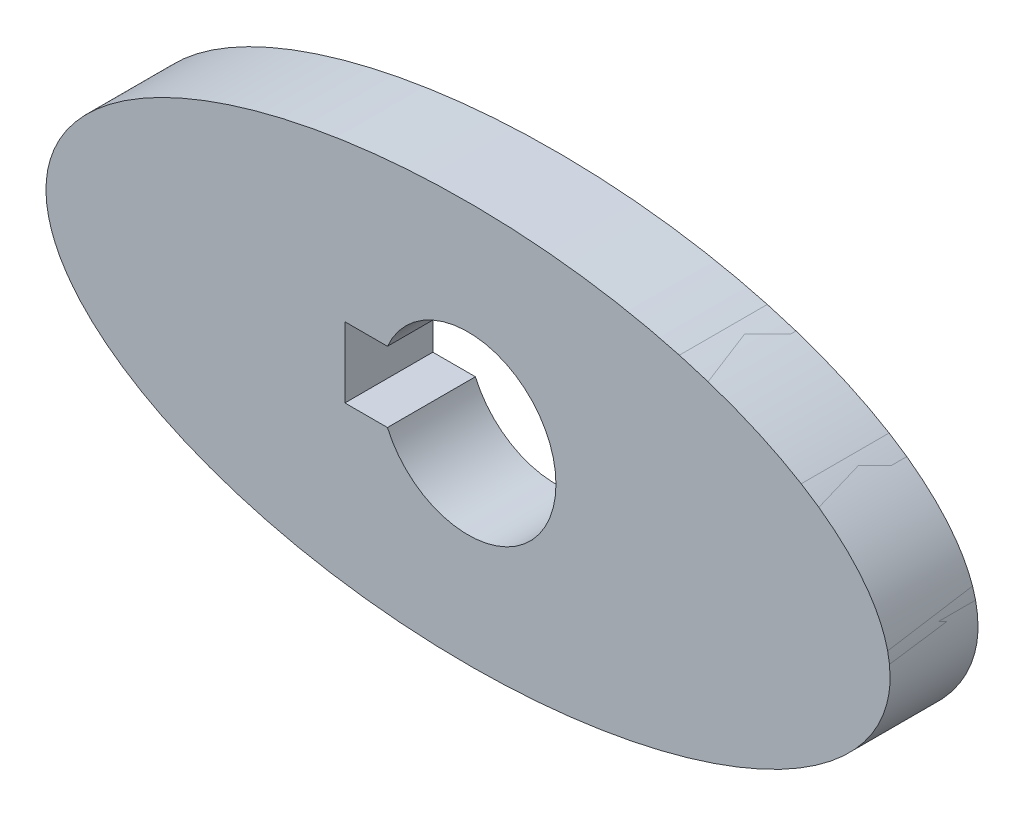
ISO-10303-21;
HEADER;
FILE_DESCRIPTION(('STEP AP214'),'2;1');
FILE_NAME('part.step','',(''),(''),'','','');
FILE_SCHEMA(('AUTOMOTIVE_DESIGN { 1 0 10303 214 1 1 1 1 }'));
ENDSEC;
DATA;
#1=APPLICATION_CONTEXT('core data for automotive mechanical design processes');
#2=APPLICATION_PROTOCOL_DEFINITION('international standard','automotive_design',2000,#1);
#3=PRODUCT_CONTEXT('',#1,'mechanical');
#4=PRODUCT('Part','Part','',(#3));
#5=PRODUCT_RELATED_PRODUCT_CATEGORY('part','',(#4));
#6=PRODUCT_DEFINITION_FORMATION('','',#4);
#7=PRODUCT_DEFINITION_CONTEXT('part definition',#1,'design');
#8=PRODUCT_DEFINITION('design','',#6,#7);
#9=PRODUCT_DEFINITION_SHAPE('','',#8);
#10=(LENGTH_UNIT() NAMED_UNIT(*) SI_UNIT(.MILLI.,.METRE.));
#11=(NAMED_UNIT(*) PLANE_ANGLE_UNIT() SI_UNIT($,.RADIAN.));
#12=(NAMED_UNIT(*) SI_UNIT($,.STERADIAN.) SOLID_ANGLE_UNIT());
#13=UNCERTAINTY_MEASURE_WITH_UNIT(LENGTH_MEASURE(1.E-05),#10,'distance_accuracy_value','');
#14=(GEOMETRIC_REPRESENTATION_CONTEXT(3) GLOBAL_UNCERTAINTY_ASSIGNED_CONTEXT((#13)) GLOBAL_UNIT_ASSIGNED_CONTEXT((#10,
#11,#12)) REPRESENTATION_CONTEXT('',''));
#15=CARTESIAN_POINT('',(0.,0.,0.));
#16=DIRECTION('',(0.,0.,1.));
#17=DIRECTION('',(1.,0.,0.));
#18=AXIS2_PLACEMENT_3D('',#15,#16,#17);
#19=CARTESIAN_POINT('',(0.,0.,5.));
#20=DIRECTION('',(0.,0.,1.));
#21=DIRECTION('',(1.,0.,0.));
#22=AXIS2_PLACEMENT_3D('',#19,#20,#21);
#23=ELLIPSE('',#22,24.,11.3936131898035);
#24=DIRECTION('',(0.,0.,-1.));
#25=VECTOR('',#24,1.);
#26=SURFACE_OF_LINEAR_EXTRUSION('',#23,#25);
#27=CARTESIAN_POINT('',(24.,0.,5.));
#28=VERTEX_POINT('',#27);
#29=EDGE_CURVE('E47',#28,#28,#23,.T.);
#30=ORIENTED_EDGE('',*,*,#29,.T.);
#31=EDGE_LOOP('',(#30));
#32=FACE_BOUND('',#31,.T.);
#33=CARTESIAN_POINT('',(0.,0.,0.));
#34=DIRECTION('',(0.,0.,1.));
#35=DIRECTION('',(1.,0.,0.));
#36=AXIS2_PLACEMENT_3D('',#33,#34,#35);
#37=ELLIPSE('',#36,24.,11.3936131898035);
#38=CARTESIAN_POINT('',(24.,0.,0.));
#39=VERTEX_POINT('',#38);
#40=EDGE_CURVE('E11',#39,#39,#37,.T.);
#41=ORIENTED_EDGE('',*,*,#40,.F.);
#42=EDGE_LOOP('',(#41));
#43=FACE_BOUND('',#42,.T.);
#44=ADVANCED_FACE('F43',(#32,#43),#26,.T.);
#45=OPEN_SHELL('',(#44));
#46=SHELL_BASED_SURFACE_MODEL('B2',(#45));
#47=CARTESIAN_POINT('',(0.,0.,5.));
#48=DIRECTION('',(0.,0.,1.));
#49=DIRECTION('',(1.,0.,0.));
#50=AXIS2_PLACEMENT_3D('',#47,#48,#49);
#51=PLANE('',#50);
#52=CARTESIAN_POINT('',(0.,0.,5.));
#53=DIRECTION('',(0.,0.,1.));
#54=DIRECTION('',(1.,0.,0.));
#55=AXIS2_PLACEMENT_3D('',#52,#53,#54);
#56=ELLIPSE('',#55,24.,11.3936131898035);
#57=CARTESIAN_POINT('',(24.,0.,5.));
#58=VERTEX_POINT('',#57);
#59=EDGE_CURVE('E41',#58,#58,#56,.T.);
#60=ORIENTED_EDGE('',*,*,#59,.T.);
#61=EDGE_LOOP('',(#60));
#62=FACE_BOUND('',#61,.T.);
#63=DIRECTION('',(-1.,0.,0.));
#64=VECTOR('',#63,1.);
#65=CARTESIAN_POINT('',(-7.,2.,5.));
#66=LINE('',#65,#64);
#67=CARTESIAN_POINT('',(-4.58257569495584,2.,5.));
#68=VERTEX_POINT('',#67);
#69=CARTESIAN_POINT('',(-7.,2.,5.));
#70=VERTEX_POINT('',#69);
#71=EDGE_CURVE('E117',#68,#70,#66,.T.);
#72=ORIENTED_EDGE('',*,*,#71,.F.);
#73=CARTESIAN_POINT('',(0.,0.,5.));
#74=DIRECTION('',(0.,0.,1.));
#75=DIRECTION('',(1.,0.,0.));
#76=AXIS2_PLACEMENT_3D('',#73,#74,#75);
#77=CIRCLE('',#76,5.);
#78=CARTESIAN_POINT('',(-4.58257569495584,-2.,5.));
#79=VERTEX_POINT('',#78);
#80=EDGE_CURVE('E109',#79,#68,#77,.T.);
#81=ORIENTED_EDGE('',*,*,#80,.F.);
#82=DIRECTION('',(1.,0.,0.));
#83=VECTOR('',#82,1.);
#84=CARTESIAN_POINT('',(-7.,-2.,5.));
#85=LINE('',#84,#83);
#86=CARTESIAN_POINT('',(-7.,-2.,5.));
#87=VERTEX_POINT('',#86);
#88=EDGE_CURVE('E130',#87,#79,#85,.T.);
#89=ORIENTED_EDGE('',*,*,#88,.F.);
#90=DIRECTION('',(0.,-1.,0.));
#91=VECTOR('',#90,1.);
#92=CARTESIAN_POINT('',(-7.,2.,5.));
#93=LINE('',#92,#91);
#94=EDGE_CURVE('E128',#70,#87,#93,.T.);
#95=ORIENTED_EDGE('',*,*,#94,.F.);
#96=EDGE_LOOP('',(#72,#81,#89,#95));
#97=FACE_BOUND('',#96,.T.);
#98=ADVANCED_FACE('F68',(#62,#97),#51,.T.);
#99=CARTESIAN_POINT('',(0.,0.,0.));
#100=DIRECTION('',(0.,0.,1.));
#101=DIRECTION('',(1.,0.,0.));
#102=AXIS2_PLACEMENT_3D('',#99,#100,#101);
#103=PLANE('',#102);
#104=CARTESIAN_POINT('',(0.,0.,0.));
#105=DIRECTION('',(0.,0.,1.));
#106=DIRECTION('',(1.,0.,0.));
#107=AXIS2_PLACEMENT_3D('',#104,#105,#106);
#108=ELLIPSE('',#107,24.,11.3936131898035);
#109=CARTESIAN_POINT('',(24.,0.,0.));
#110=VERTEX_POINT('',#109);
#111=EDGE_CURVE('E73',#110,#110,#108,.T.);
#112=ORIENTED_EDGE('',*,*,#111,.F.);
#113=EDGE_LOOP('',(#112));
#114=FACE_BOUND('',#113,.T.);
#115=CARTESIAN_POINT('',(0.,0.,0.));
#116=DIRECTION('',(0.,0.,1.));
#117=DIRECTION('',(1.,0.,0.));
#118=AXIS2_PLACEMENT_3D('',#115,#116,#117);
#119=CIRCLE('',#118,5.);
#120=CARTESIAN_POINT('',(-4.58257569495584,-2.,0.));
#121=VERTEX_POINT('',#120);
#122=CARTESIAN_POINT('',(-4.58257569495584,2.,0.));
#123=VERTEX_POINT('',#122);
#124=EDGE_CURVE('E91',#121,#123,#119,.T.);
#125=ORIENTED_EDGE('',*,*,#124,.T.);
#126=DIRECTION('',(-1.,0.,0.));
#127=VECTOR('',#126,1.);
#128=CARTESIAN_POINT('',(-7.,2.,0.));
#129=LINE('',#128,#127);
#130=CARTESIAN_POINT('',(-7.,2.,0.));
#131=VERTEX_POINT('',#130);
#132=EDGE_CURVE('E124',#123,#131,#129,.T.);
#133=ORIENTED_EDGE('',*,*,#132,.T.);
#134=DIRECTION('',(0.,-1.,0.));
#135=VECTOR('',#134,1.);
#136=CARTESIAN_POINT('',(-7.,2.,0.));
#137=LINE('',#136,#135);
#138=CARTESIAN_POINT('',(-7.,-2.,0.));
#139=VERTEX_POINT('',#138);
#140=EDGE_CURVE('E136',#131,#139,#137,.T.);
#141=ORIENTED_EDGE('',*,*,#140,.T.);
#142=DIRECTION('',(1.,0.,0.));
#143=VECTOR('',#142,1.);
#144=CARTESIAN_POINT('',(-7.,-2.,0.));
#145=LINE('',#144,#143);
#146=EDGE_CURVE('E118',#139,#121,#145,.T.);
#147=ORIENTED_EDGE('',*,*,#146,.T.);
#148=EDGE_LOOP('',(#125,#133,#141,#147));
#149=FACE_BOUND('',#148,.T.);
#150=ADVANCED_FACE('F148',(#114,#149),#103,.F.);
#151=DIRECTION('',(0.,0.,-1.));
#152=VECTOR('',#151,1.);
#153=SURFACE_OF_LINEAR_EXTRUSION('',#56,#152);
#154=ORIENTED_EDGE('',*,*,#59,.F.);
#155=EDGE_LOOP('',(#154));
#156=FACE_BOUND('',#155,.T.);
#157=ORIENTED_EDGE('',*,*,#111,.T.);
#158=EDGE_LOOP('',(#157));
#159=FACE_BOUND('',#158,.T.);
#160=ADVANCED_FACE('F70',(#156,#159),#153,.F.);
#161=CARTESIAN_POINT('',(0.,0.,5.));
#162=DIRECTION('',(0.,0.,-1.));
#163=DIRECTION('',(-1.,0.,0.));
#164=AXIS2_PLACEMENT_3D('',#161,#162,#163);
#165=CYLINDRICAL_SURFACE('',#164,5.);
#166=ORIENTED_EDGE('',*,*,#124,.F.);
#167=DIRECTION('',(0.,0.,-1.));
#168=VECTOR('',#167,1.);
#169=CARTESIAN_POINT('',(-4.58257569495584,-2.,5.));
#170=LINE('',#169,#168);
#171=EDGE_CURVE('E113',#79,#121,#170,.T.);
#172=ORIENTED_EDGE('',*,*,#171,.F.);
#173=ORIENTED_EDGE('',*,*,#80,.T.);
#174=DIRECTION('',(0.,0.,-1.));
#175=VECTOR('',#174,1.);
#176=CARTESIAN_POINT('',(-4.58257569495584,2.,5.));
#177=LINE('',#176,#175);
#178=EDGE_CURVE('E112',#68,#123,#177,.T.);
#179=ORIENTED_EDGE('',*,*,#178,.T.);
#180=EDGE_LOOP('',(#166,#172,#173,#179));
#181=FACE_BOUND('',#180,.T.);
#182=ADVANCED_FACE('F111',(#181),#165,.F.);
#183=CARTESIAN_POINT('',(-7.,2.,5.));
#184=DIRECTION('',(0.,-1.,0.));
#185=DIRECTION('',(0.,0.,-1.));
#186=AXIS2_PLACEMENT_3D('',#183,#184,#185);
#187=PLANE('',#186);
#188=ORIENTED_EDGE('',*,*,#132,.F.);
#189=ORIENTED_EDGE('',*,*,#178,.F.);
#190=ORIENTED_EDGE('',*,*,#71,.T.);
#191=DIRECTION('',(0.,0.,-1.));
#192=VECTOR('',#191,1.);
#193=CARTESIAN_POINT('',(-7.,2.,5.));
#194=LINE('',#193,#192);
#195=EDGE_CURVE('E125',#70,#131,#194,.T.);
#196=ORIENTED_EDGE('',*,*,#195,.T.);
#197=EDGE_LOOP('',(#188,#189,#190,#196));
#198=FACE_BOUND('',#197,.T.);
#199=ADVANCED_FACE('F121',(#198),#187,.T.);
#200=CARTESIAN_POINT('',(-7.,2.,5.));
#201=DIRECTION('',(1.,0.,0.));
#202=DIRECTION('',(0.,0.,-1.));
#203=AXIS2_PLACEMENT_3D('',#200,#201,#202);
#204=PLANE('',#203);
#205=ORIENTED_EDGE('',*,*,#140,.F.);
#206=ORIENTED_EDGE('',*,*,#195,.F.);
#207=ORIENTED_EDGE('',*,*,#94,.T.);
#208=DIRECTION('',(0.,0.,-1.));
#209=VECTOR('',#208,1.);
#210=CARTESIAN_POINT('',(-7.,-2.,5.));
#211=LINE('',#210,#209);
#212=EDGE_CURVE('E83',#87,#139,#211,.T.);
#213=ORIENTED_EDGE('',*,*,#212,.T.);
#214=EDGE_LOOP('',(#205,#206,#207,#213));
#215=FACE_BOUND('',#214,.T.);
#216=ADVANCED_FACE('F146',(#215),#204,.T.);
#217=CARTESIAN_POINT('',(-7.,-2.,5.));
#218=DIRECTION('',(0.,1.,0.));
#219=DIRECTION('',(0.,0.,1.));
#220=AXIS2_PLACEMENT_3D('',#217,#218,#219);
#221=PLANE('',#220);
#222=ORIENTED_EDGE('',*,*,#146,.F.);
#223=ORIENTED_EDGE('',*,*,#212,.F.);
#224=ORIENTED_EDGE('',*,*,#88,.T.);
#225=ORIENTED_EDGE('',*,*,#171,.T.);
#226=EDGE_LOOP('',(#222,#223,#224,#225));
#227=FACE_BOUND('',#226,.T.);
#228=ADVANCED_FACE('F149',(#227),#221,.T.);
#229=CLOSED_SHELL('',(#98,#150,#160,#182,#199,#216,#228));
#230=MANIFOLD_SOLID_BREP('B6',#229);
#231=ADVANCED_BREP_SHAPE_REPRESENTATION('',(#18,#230),#14);
#232=MANIFOLD_SURFACE_SHAPE_REPRESENTATION('',(#18,#46),#14);
#233=SHAPE_REPRESENTATION('',(#18),#14);
#234=SHAPE_DEFINITION_REPRESENTATION(#9,#233);
#235=SHAPE_REPRESENTATION_RELATIONSHIP('','',#233,#231);
#236=SHAPE_REPRESENTATION_RELATIONSHIP('','',#233,#232);
ENDSEC;
END-ISO-10303-21;
